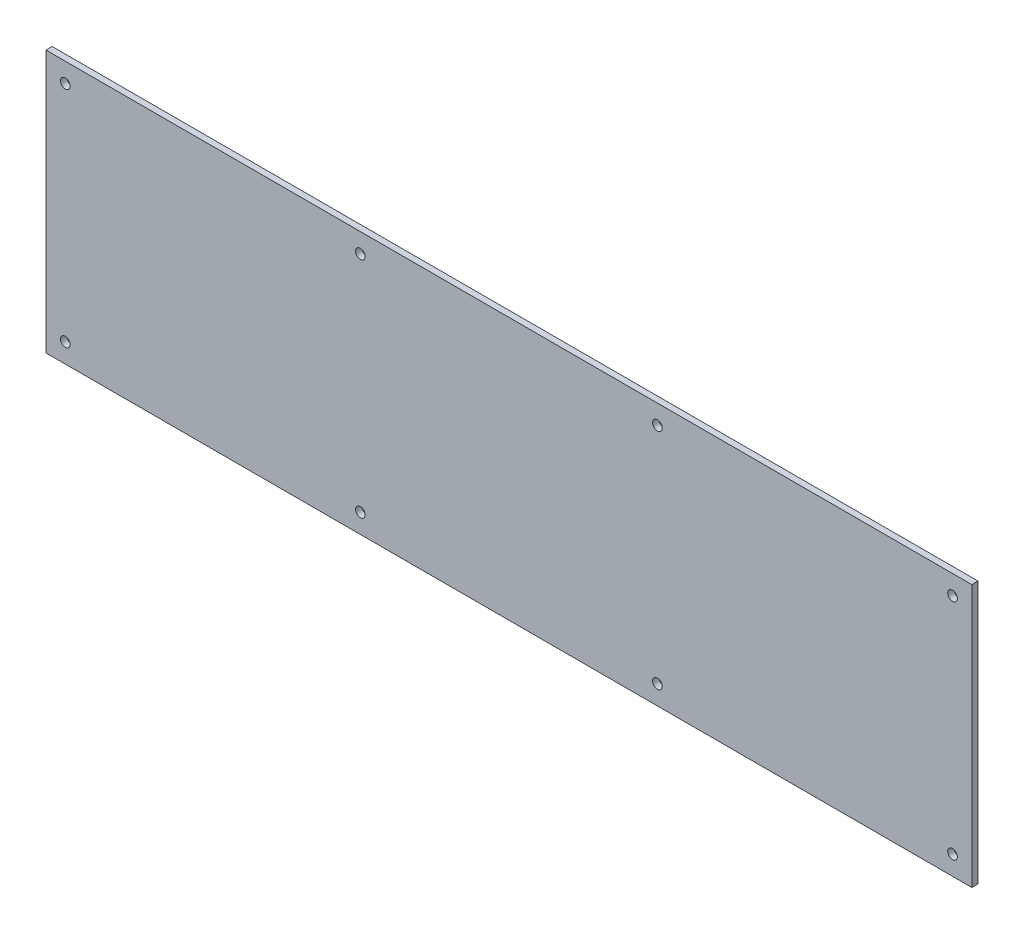
ISO-10303-21;
HEADER;
FILE_DESCRIPTION(('STEP AP214'),'2;1');
FILE_NAME('part.step','',(''),(''),'','','');
FILE_SCHEMA(('AUTOMOTIVE_DESIGN { 1 0 10303 214 1 1 1 1 }'));
ENDSEC;
DATA;
#1=APPLICATION_CONTEXT('core data for automotive mechanical design processes');
#2=APPLICATION_PROTOCOL_DEFINITION('international standard','automotive_design',2000,#1);
#3=PRODUCT_CONTEXT('',#1,'mechanical');
#4=PRODUCT('Part','Part','',(#3));
#5=PRODUCT_RELATED_PRODUCT_CATEGORY('part','',(#4));
#6=PRODUCT_DEFINITION_FORMATION('','',#4);
#7=PRODUCT_DEFINITION_CONTEXT('part definition',#1,'design');
#8=PRODUCT_DEFINITION('design','',#6,#7);
#9=PRODUCT_DEFINITION_SHAPE('','',#8);
#10=(LENGTH_UNIT() NAMED_UNIT(*) SI_UNIT(.MILLI.,.METRE.));
#11=(NAMED_UNIT(*) PLANE_ANGLE_UNIT() SI_UNIT($,.RADIAN.));
#12=(NAMED_UNIT(*) SI_UNIT($,.STERADIAN.) SOLID_ANGLE_UNIT());
#13=UNCERTAINTY_MEASURE_WITH_UNIT(LENGTH_MEASURE(1.E-05),#10,'distance_accuracy_value','');
#14=(GEOMETRIC_REPRESENTATION_CONTEXT(3) GLOBAL_UNCERTAINTY_ASSIGNED_CONTEXT((#13)) GLOBAL_UNIT_ASSIGNED_CONTEXT((#10,
#11,#12)) REPRESENTATION_CONTEXT('',''));
#15=CARTESIAN_POINT('',(0.,0.,0.));
#16=DIRECTION('',(0.,0.,1.));
#17=DIRECTION('',(1.,0.,0.));
#18=AXIS2_PLACEMENT_3D('',#15,#16,#17);
#19=CARTESIAN_POINT('',(0.,228.6,2.032));
#20=DIRECTION('',(1.,0.,0.));
#21=DIRECTION('',(0.,1.,0.));
#22=AXIS2_PLACEMENT_3D('',#19,#20,#21);
#23=PLANE('',#22);
#24=DIRECTION('',(0.,-1.,0.));
#25=VECTOR('',#24,1.);
#26=CARTESIAN_POINT('',(0.,228.6,0.));
#27=LINE('',#26,#25);
#28=CARTESIAN_POINT('',(0.,228.6,0.));
#29=VERTEX_POINT('',#28);
#30=CARTESIAN_POINT('',(0.,142.24,0.));
#31=VERTEX_POINT('',#30);
#32=EDGE_CURVE('E94',#29,#31,#27,.T.);
#33=ORIENTED_EDGE('',*,*,#32,.T.);
#34=DIRECTION('',(0.,0.,-1.));
#35=VECTOR('',#34,1.);
#36=CARTESIAN_POINT('',(0.,142.24,2.032));
#37=LINE('',#36,#35);
#38=CARTESIAN_POINT('',(0.,142.24,2.032));
#39=VERTEX_POINT('',#38);
#40=EDGE_CURVE('E11',#39,#31,#37,.T.);
#41=ORIENTED_EDGE('',*,*,#40,.F.);
#42=DIRECTION('',(0.,-1.,0.));
#43=VECTOR('',#42,1.);
#44=CARTESIAN_POINT('',(0.,228.6,2.032));
#45=LINE('',#44,#43);
#46=CARTESIAN_POINT('',(0.,228.6,2.032));
#47=VERTEX_POINT('',#46);
#48=EDGE_CURVE('E82',#47,#39,#45,.T.);
#49=ORIENTED_EDGE('',*,*,#48,.F.);
#50=DIRECTION('',(0.,0.,-1.));
#51=VECTOR('',#50,1.);
#52=CARTESIAN_POINT('',(0.,228.6,2.032));
#53=LINE('',#52,#51);
#54=EDGE_CURVE('E90',#47,#29,#53,.T.);
#55=ORIENTED_EDGE('',*,*,#54,.T.);
#56=EDGE_LOOP('',(#33,#41,#49,#55));
#57=FACE_BOUND('',#56,.T.);
#58=ADVANCED_FACE('F31',(#57),#23,.F.);
#59=CARTESIAN_POINT('',(0.,142.24,2.032));
#60=DIRECTION('',(0.,1.,0.));
#61=DIRECTION('',(0.,0.,1.));
#62=AXIS2_PLACEMENT_3D('',#59,#60,#61);
#63=PLANE('',#62);
#64=DIRECTION('',(1.,0.,0.));
#65=VECTOR('',#64,1.);
#66=CARTESIAN_POINT('',(0.,142.24,0.));
#67=LINE('',#66,#65);
#68=CARTESIAN_POINT('',(304.8,142.24,0.));
#69=VERTEX_POINT('',#68);
#70=EDGE_CURVE('E86',#31,#69,#67,.T.);
#71=ORIENTED_EDGE('',*,*,#70,.T.);
#72=DIRECTION('',(0.,0.,-1.));
#73=VECTOR('',#72,1.);
#74=CARTESIAN_POINT('',(304.8,142.24,2.032));
#75=LINE('',#74,#73);
#76=CARTESIAN_POINT('',(304.8,142.24,2.032));
#77=VERTEX_POINT('',#76);
#78=EDGE_CURVE('E39',#77,#69,#75,.T.);
#79=ORIENTED_EDGE('',*,*,#78,.F.);
#80=DIRECTION('',(1.,0.,0.));
#81=VECTOR('',#80,1.);
#82=CARTESIAN_POINT('',(0.,142.24,2.032));
#83=LINE('',#82,#81);
#84=EDGE_CURVE('E77',#39,#77,#83,.T.);
#85=ORIENTED_EDGE('',*,*,#84,.F.);
#86=ORIENTED_EDGE('',*,*,#40,.T.);
#87=EDGE_LOOP('',(#71,#79,#85,#86));
#88=FACE_BOUND('',#87,.T.);
#89=ADVANCED_FACE('F85',(#88),#63,.F.);
#90=CARTESIAN_POINT('',(304.8,228.6,2.032));
#91=DIRECTION('',(-1.,0.,0.));
#92=DIRECTION('',(0.,-1.,0.));
#93=AXIS2_PLACEMENT_3D('',#90,#91,#92);
#94=PLANE('',#93);
#95=DIRECTION('',(0.,1.,0.));
#96=VECTOR('',#95,1.);
#97=CARTESIAN_POINT('',(304.8,228.6,0.));
#98=LINE('',#97,#96);
#99=CARTESIAN_POINT('',(304.8,228.6,0.));
#100=VERTEX_POINT('',#99);
#101=EDGE_CURVE('E64',#69,#100,#98,.T.);
#102=ORIENTED_EDGE('',*,*,#101,.T.);
#103=DIRECTION('',(0.,0.,-1.));
#104=VECTOR('',#103,1.);
#105=CARTESIAN_POINT('',(304.8,228.6,2.032));
#106=LINE('',#105,#104);
#107=CARTESIAN_POINT('',(304.8,228.6,2.032));
#108=VERTEX_POINT('',#107);
#109=EDGE_CURVE('E87',#108,#100,#106,.T.);
#110=ORIENTED_EDGE('',*,*,#109,.F.);
#111=DIRECTION('',(0.,1.,0.));
#112=VECTOR('',#111,1.);
#113=CARTESIAN_POINT('',(304.8,228.6,2.032));
#114=LINE('',#113,#112);
#115=EDGE_CURVE('E80',#77,#108,#114,.T.);
#116=ORIENTED_EDGE('',*,*,#115,.F.);
#117=ORIENTED_EDGE('',*,*,#78,.T.);
#118=EDGE_LOOP('',(#102,#110,#116,#117));
#119=FACE_BOUND('',#118,.T.);
#120=ADVANCED_FACE('F88',(#119),#94,.F.);
#121=CARTESIAN_POINT('',(0.,228.6,2.032));
#122=DIRECTION('',(0.,-1.,0.));
#123=DIRECTION('',(0.,0.,-1.));
#124=AXIS2_PLACEMENT_3D('',#121,#122,#123);
#125=PLANE('',#124);
#126=DIRECTION('',(-1.,0.,0.));
#127=VECTOR('',#126,1.);
#128=CARTESIAN_POINT('',(0.,228.6,0.));
#129=LINE('',#128,#127);
#130=EDGE_CURVE('E70',#100,#29,#129,.T.);
#131=ORIENTED_EDGE('',*,*,#130,.T.);
#132=ORIENTED_EDGE('',*,*,#54,.F.);
#133=DIRECTION('',(-1.,0.,0.));
#134=VECTOR('',#133,1.);
#135=CARTESIAN_POINT('',(0.,228.6,2.032));
#136=LINE('',#135,#134);
#137=EDGE_CURVE('E47',#108,#47,#136,.T.);
#138=ORIENTED_EDGE('',*,*,#137,.F.);
#139=ORIENTED_EDGE('',*,*,#109,.T.);
#140=EDGE_LOOP('',(#131,#132,#138,#139));
#141=FACE_BOUND('',#140,.T.);
#142=ADVANCED_FACE('F102',(#141),#125,.F.);
#143=CARTESIAN_POINT('',(0.,142.24,2.032));
#144=DIRECTION('',(0.,0.,1.));
#145=DIRECTION('',(1.,0.,0.));
#146=AXIS2_PLACEMENT_3D('',#143,#144,#145);
#147=PLANE('',#146);
#148=CARTESIAN_POINT('',(298.45,222.25,2.032));
#149=DIRECTION('',(0.,0.,1.));
#150=DIRECTION('',(-1.,0.,0.));
#151=AXIS2_PLACEMENT_3D('',#148,#149,#150);
#152=CIRCLE('',#151,1.58750000000004);
#153=CARTESIAN_POINT('',(296.8625,222.25,2.032));
#154=VERTEX_POINT('',#153);
#155=EDGE_CURVE('E150',#154,#154,#152,.T.);
#156=ORIENTED_EDGE('',*,*,#155,.F.);
#157=EDGE_LOOP('',(#156));
#158=FACE_BOUND('',#157,.T.);
#159=CARTESIAN_POINT('',(298.45,148.59,2.032));
#160=DIRECTION('',(0.,0.,1.));
#161=DIRECTION('',(-1.,0.,0.));
#162=AXIS2_PLACEMENT_3D('',#159,#160,#161);
#163=CIRCLE('',#162,1.58750000000004);
#164=CARTESIAN_POINT('',(296.8625,148.59,2.032));
#165=VERTEX_POINT('',#164);
#166=EDGE_CURVE('E144',#165,#165,#163,.T.);
#167=ORIENTED_EDGE('',*,*,#166,.F.);
#168=EDGE_LOOP('',(#167));
#169=FACE_BOUND('',#168,.T.);
#170=CARTESIAN_POINT('',(201.295,222.25,2.032));
#171=DIRECTION('',(0.,0.,1.));
#172=DIRECTION('',(-1.,0.,0.));
#173=AXIS2_PLACEMENT_3D('',#170,#171,#172);
#174=CIRCLE('',#173,1.58749999999999);
#175=CARTESIAN_POINT('',(199.7075,222.25,2.032));
#176=VERTEX_POINT('',#175);
#177=EDGE_CURVE('E138',#176,#176,#174,.T.);
#178=ORIENTED_EDGE('',*,*,#177,.F.);
#179=EDGE_LOOP('',(#178));
#180=FACE_BOUND('',#179,.T.);
#181=CARTESIAN_POINT('',(201.295,148.59,2.032));
#182=DIRECTION('',(0.,0.,1.));
#183=DIRECTION('',(-1.,0.,0.));
#184=AXIS2_PLACEMENT_3D('',#181,#182,#183);
#185=CIRCLE('',#184,1.58750000000001);
#186=CARTESIAN_POINT('',(199.7075,148.59,2.032));
#187=VERTEX_POINT('',#186);
#188=EDGE_CURVE('E132',#187,#187,#185,.T.);
#189=ORIENTED_EDGE('',*,*,#188,.F.);
#190=EDGE_LOOP('',(#189));
#191=FACE_BOUND('',#190,.T.);
#192=CARTESIAN_POINT('',(103.505,148.59,2.032));
#193=DIRECTION('',(0.,0.,1.));
#194=DIRECTION('',(1.,0.,0.));
#195=AXIS2_PLACEMENT_3D('',#192,#193,#194);
#196=CIRCLE('',#195,1.58749999999999);
#197=CARTESIAN_POINT('',(105.0925,148.59,2.032));
#198=VERTEX_POINT('',#197);
#199=EDGE_CURVE('E126',#198,#198,#196,.T.);
#200=ORIENTED_EDGE('',*,*,#199,.F.);
#201=EDGE_LOOP('',(#200));
#202=FACE_BOUND('',#201,.T.);
#203=CARTESIAN_POINT('',(103.505,222.25,2.032));
#204=DIRECTION('',(0.,0.,1.));
#205=DIRECTION('',(1.,0.,0.));
#206=AXIS2_PLACEMENT_3D('',#203,#204,#205);
#207=CIRCLE('',#206,1.58749999999999);
#208=CARTESIAN_POINT('',(105.0925,222.25,2.032));
#209=VERTEX_POINT('',#208);
#210=EDGE_CURVE('E120',#209,#209,#207,.T.);
#211=ORIENTED_EDGE('',*,*,#210,.F.);
#212=EDGE_LOOP('',(#211));
#213=FACE_BOUND('',#212,.T.);
#214=CARTESIAN_POINT('',(6.34999999999999,148.59,2.032));
#215=DIRECTION('',(0.,0.,1.));
#216=DIRECTION('',(1.,0.,0.));
#217=AXIS2_PLACEMENT_3D('',#214,#215,#216);
#218=CIRCLE('',#217,1.5875);
#219=CARTESIAN_POINT('',(7.93749999999999,148.59,2.032));
#220=VERTEX_POINT('',#219);
#221=EDGE_CURVE('E114',#220,#220,#218,.T.);
#222=ORIENTED_EDGE('',*,*,#221,.F.);
#223=EDGE_LOOP('',(#222));
#224=FACE_BOUND('',#223,.T.);
#225=CARTESIAN_POINT('',(6.34999999999997,222.25,2.032));
#226=DIRECTION('',(0.,0.,1.));
#227=DIRECTION('',(1.,0.,0.));
#228=AXIS2_PLACEMENT_3D('',#225,#226,#227);
#229=CIRCLE('',#228,1.5875);
#230=CARTESIAN_POINT('',(7.93749999999997,222.25,2.032));
#231=VERTEX_POINT('',#230);
#232=EDGE_CURVE('E108',#231,#231,#229,.T.);
#233=ORIENTED_EDGE('',*,*,#232,.F.);
#234=EDGE_LOOP('',(#233));
#235=FACE_BOUND('',#234,.T.);
#236=ORIENTED_EDGE('',*,*,#48,.T.);
#237=ORIENTED_EDGE('',*,*,#84,.T.);
#238=ORIENTED_EDGE('',*,*,#115,.T.);
#239=ORIENTED_EDGE('',*,*,#137,.T.);
#240=EDGE_LOOP('',(#236,#237,#238,#239));
#241=FACE_BOUND('',#240,.T.);
#242=ADVANCED_FACE('F78',(#158,#169,#180,#191,#202,#213,#224,#235,#241),#147,.T.);
#243=CARTESIAN_POINT('',(0.,142.24,0.));
#244=DIRECTION('',(0.,0.,1.));
#245=DIRECTION('',(1.,0.,0.));
#246=AXIS2_PLACEMENT_3D('',#243,#244,#245);
#247=PLANE('',#246);
#248=CARTESIAN_POINT('',(298.45,222.25,0.));
#249=DIRECTION('',(0.,0.,1.));
#250=DIRECTION('',(-1.,0.,0.));
#251=AXIS2_PLACEMENT_3D('',#248,#249,#250);
#252=CIRCLE('',#251,1.58750000000004);
#253=CARTESIAN_POINT('',(296.8625,222.25,0.));
#254=VERTEX_POINT('',#253);
#255=EDGE_CURVE('E147',#254,#254,#252,.T.);
#256=ORIENTED_EDGE('',*,*,#255,.T.);
#257=EDGE_LOOP('',(#256));
#258=FACE_BOUND('',#257,.T.);
#259=CARTESIAN_POINT('',(298.45,148.59,0.));
#260=DIRECTION('',(0.,0.,1.));
#261=DIRECTION('',(-1.,0.,0.));
#262=AXIS2_PLACEMENT_3D('',#259,#260,#261);
#263=CIRCLE('',#262,1.58750000000004);
#264=CARTESIAN_POINT('',(296.8625,148.59,0.));
#265=VERTEX_POINT('',#264);
#266=EDGE_CURVE('E141',#265,#265,#263,.T.);
#267=ORIENTED_EDGE('',*,*,#266,.T.);
#268=EDGE_LOOP('',(#267));
#269=FACE_BOUND('',#268,.T.);
#270=CARTESIAN_POINT('',(201.295,222.25,0.));
#271=DIRECTION('',(0.,0.,1.));
#272=DIRECTION('',(-1.,0.,0.));
#273=AXIS2_PLACEMENT_3D('',#270,#271,#272);
#274=CIRCLE('',#273,1.58749999999999);
#275=CARTESIAN_POINT('',(199.7075,222.25,0.));
#276=VERTEX_POINT('',#275);
#277=EDGE_CURVE('E135',#276,#276,#274,.T.);
#278=ORIENTED_EDGE('',*,*,#277,.T.);
#279=EDGE_LOOP('',(#278));
#280=FACE_BOUND('',#279,.T.);
#281=CARTESIAN_POINT('',(201.295,148.59,0.));
#282=DIRECTION('',(0.,0.,1.));
#283=DIRECTION('',(-1.,0.,0.));
#284=AXIS2_PLACEMENT_3D('',#281,#282,#283);
#285=CIRCLE('',#284,1.58750000000001);
#286=CARTESIAN_POINT('',(199.7075,148.59,0.));
#287=VERTEX_POINT('',#286);
#288=EDGE_CURVE('E129',#287,#287,#285,.T.);
#289=ORIENTED_EDGE('',*,*,#288,.T.);
#290=EDGE_LOOP('',(#289));
#291=FACE_BOUND('',#290,.T.);
#292=CARTESIAN_POINT('',(103.505,148.59,0.));
#293=DIRECTION('',(0.,0.,1.));
#294=DIRECTION('',(1.,0.,0.));
#295=AXIS2_PLACEMENT_3D('',#292,#293,#294);
#296=CIRCLE('',#295,1.58749999999999);
#297=CARTESIAN_POINT('',(105.0925,148.59,0.));
#298=VERTEX_POINT('',#297);
#299=EDGE_CURVE('E123',#298,#298,#296,.T.);
#300=ORIENTED_EDGE('',*,*,#299,.T.);
#301=EDGE_LOOP('',(#300));
#302=FACE_BOUND('',#301,.T.);
#303=CARTESIAN_POINT('',(103.505,222.25,0.));
#304=DIRECTION('',(0.,0.,1.));
#305=DIRECTION('',(1.,0.,0.));
#306=AXIS2_PLACEMENT_3D('',#303,#304,#305);
#307=CIRCLE('',#306,1.58749999999999);
#308=CARTESIAN_POINT('',(105.0925,222.25,0.));
#309=VERTEX_POINT('',#308);
#310=EDGE_CURVE('E117',#309,#309,#307,.T.);
#311=ORIENTED_EDGE('',*,*,#310,.T.);
#312=EDGE_LOOP('',(#311));
#313=FACE_BOUND('',#312,.T.);
#314=CARTESIAN_POINT('',(6.34999999999999,148.59,0.));
#315=DIRECTION('',(0.,0.,1.));
#316=DIRECTION('',(1.,0.,0.));
#317=AXIS2_PLACEMENT_3D('',#314,#315,#316);
#318=CIRCLE('',#317,1.5875);
#319=CARTESIAN_POINT('',(7.93749999999999,148.59,0.));
#320=VERTEX_POINT('',#319);
#321=EDGE_CURVE('E111',#320,#320,#318,.T.);
#322=ORIENTED_EDGE('',*,*,#321,.T.);
#323=EDGE_LOOP('',(#322));
#324=FACE_BOUND('',#323,.T.);
#325=CARTESIAN_POINT('',(6.34999999999997,222.25,0.));
#326=DIRECTION('',(0.,0.,1.));
#327=DIRECTION('',(1.,0.,0.));
#328=AXIS2_PLACEMENT_3D('',#325,#326,#327);
#329=CIRCLE('',#328,1.5875);
#330=CARTESIAN_POINT('',(7.93749999999997,222.25,0.));
#331=VERTEX_POINT('',#330);
#332=EDGE_CURVE('E97',#331,#331,#329,.T.);
#333=ORIENTED_EDGE('',*,*,#332,.T.);
#334=EDGE_LOOP('',(#333));
#335=FACE_BOUND('',#334,.T.);
#336=ORIENTED_EDGE('',*,*,#32,.F.);
#337=ORIENTED_EDGE('',*,*,#130,.F.);
#338=ORIENTED_EDGE('',*,*,#101,.F.);
#339=ORIENTED_EDGE('',*,*,#70,.F.);
#340=EDGE_LOOP('',(#336,#337,#338,#339));
#341=FACE_BOUND('',#340,.T.);
#342=ADVANCED_FACE('F105',(#258,#269,#280,#291,#302,#313,#324,#335,#341),#247,.F.);
#343=CARTESIAN_POINT('',(6.34999999999997,222.25,0.));
#344=DIRECTION('',(0.,0.,1.));
#345=DIRECTION('',(1.,0.,0.));
#346=AXIS2_PLACEMENT_3D('',#343,#344,#345);
#347=CYLINDRICAL_SURFACE('',#346,1.5875);
#348=ORIENTED_EDGE('',*,*,#332,.F.);
#349=EDGE_LOOP('',(#348));
#350=FACE_BOUND('',#349,.T.);
#351=ORIENTED_EDGE('',*,*,#232,.T.);
#352=EDGE_LOOP('',(#351));
#353=FACE_BOUND('',#352,.T.);
#354=ADVANCED_FACE('F182',(#350,#353),#347,.F.);
#355=CARTESIAN_POINT('',(6.34999999999999,148.59,0.));
#356=DIRECTION('',(0.,0.,1.));
#357=DIRECTION('',(1.,0.,0.));
#358=AXIS2_PLACEMENT_3D('',#355,#356,#357);
#359=CYLINDRICAL_SURFACE('',#358,1.5875);
#360=ORIENTED_EDGE('',*,*,#321,.F.);
#361=EDGE_LOOP('',(#360));
#362=FACE_BOUND('',#361,.T.);
#363=ORIENTED_EDGE('',*,*,#221,.T.);
#364=EDGE_LOOP('',(#363));
#365=FACE_BOUND('',#364,.T.);
#366=ADVANCED_FACE('F184',(#362,#365),#359,.F.);
#367=CARTESIAN_POINT('',(103.505,222.25,0.));
#368=DIRECTION('',(0.,0.,1.));
#369=DIRECTION('',(1.,0.,0.));
#370=AXIS2_PLACEMENT_3D('',#367,#368,#369);
#371=CYLINDRICAL_SURFACE('',#370,1.58749999999999);
#372=ORIENTED_EDGE('',*,*,#310,.F.);
#373=EDGE_LOOP('',(#372));
#374=FACE_BOUND('',#373,.T.);
#375=ORIENTED_EDGE('',*,*,#210,.T.);
#376=EDGE_LOOP('',(#375));
#377=FACE_BOUND('',#376,.T.);
#378=ADVANCED_FACE('F191',(#374,#377),#371,.F.);
#379=CARTESIAN_POINT('',(103.505,148.59,0.));
#380=DIRECTION('',(0.,0.,1.));
#381=DIRECTION('',(1.,0.,0.));
#382=AXIS2_PLACEMENT_3D('',#379,#380,#381);
#383=CYLINDRICAL_SURFACE('',#382,1.58749999999999);
#384=ORIENTED_EDGE('',*,*,#299,.F.);
#385=EDGE_LOOP('',(#384));
#386=FACE_BOUND('',#385,.T.);
#387=ORIENTED_EDGE('',*,*,#199,.T.);
#388=EDGE_LOOP('',(#387));
#389=FACE_BOUND('',#388,.T.);
#390=ADVANCED_FACE('F237',(#386,#389),#383,.F.);
#391=CARTESIAN_POINT('',(201.295,148.59,0.));
#392=DIRECTION('',(0.,0.,1.));
#393=DIRECTION('',(1.,0.,0.));
#394=AXIS2_PLACEMENT_3D('',#391,#392,#393);
#395=CYLINDRICAL_SURFACE('',#394,1.58750000000001);
#396=ORIENTED_EDGE('',*,*,#288,.F.);
#397=EDGE_LOOP('',(#396));
#398=FACE_BOUND('',#397,.T.);
#399=ORIENTED_EDGE('',*,*,#188,.T.);
#400=EDGE_LOOP('',(#399));
#401=FACE_BOUND('',#400,.T.);
#402=ADVANCED_FACE('F247',(#398,#401),#395,.F.);
#403=CARTESIAN_POINT('',(201.295,222.25,0.));
#404=DIRECTION('',(0.,0.,1.));
#405=DIRECTION('',(1.,0.,0.));
#406=AXIS2_PLACEMENT_3D('',#403,#404,#405);
#407=CYLINDRICAL_SURFACE('',#406,1.58749999999999);
#408=ORIENTED_EDGE('',*,*,#277,.F.);
#409=EDGE_LOOP('',(#408));
#410=FACE_BOUND('',#409,.T.);
#411=ORIENTED_EDGE('',*,*,#177,.T.);
#412=EDGE_LOOP('',(#411));
#413=FACE_BOUND('',#412,.T.);
#414=ADVANCED_FACE('F257',(#410,#413),#407,.F.);
#415=CARTESIAN_POINT('',(298.45,148.59,0.));
#416=DIRECTION('',(0.,0.,1.));
#417=DIRECTION('',(1.,0.,0.));
#418=AXIS2_PLACEMENT_3D('',#415,#416,#417);
#419=CYLINDRICAL_SURFACE('',#418,1.58750000000004);
#420=ORIENTED_EDGE('',*,*,#266,.F.);
#421=EDGE_LOOP('',(#420));
#422=FACE_BOUND('',#421,.T.);
#423=ORIENTED_EDGE('',*,*,#166,.T.);
#424=EDGE_LOOP('',(#423));
#425=FACE_BOUND('',#424,.T.);
#426=ADVANCED_FACE('F161',(#422,#425),#419,.F.);
#427=CARTESIAN_POINT('',(298.45,222.25,0.));
#428=DIRECTION('',(0.,0.,1.));
#429=DIRECTION('',(1.,0.,0.));
#430=AXIS2_PLACEMENT_3D('',#427,#428,#429);
#431=CYLINDRICAL_SURFACE('',#430,1.58750000000004);
#432=ORIENTED_EDGE('',*,*,#255,.F.);
#433=EDGE_LOOP('',(#432));
#434=FACE_BOUND('',#433,.T.);
#435=ORIENTED_EDGE('',*,*,#155,.T.);
#436=EDGE_LOOP('',(#435));
#437=FACE_BOUND('',#436,.T.);
#438=ADVANCED_FACE('F158',(#434,#437),#431,.F.);
#439=CLOSED_SHELL('',(#58,#89,#120,#142,#242,#342,#354,#366,#378,#390,#402,#414,#426,#438));
#440=MANIFOLD_SOLID_BREP('B2',#439);
#441=ADVANCED_BREP_SHAPE_REPRESENTATION('',(#18,#440),#14);
#442=SHAPE_DEFINITION_REPRESENTATION(#9,#441);
ENDSEC;
END-ISO-10303-21;
